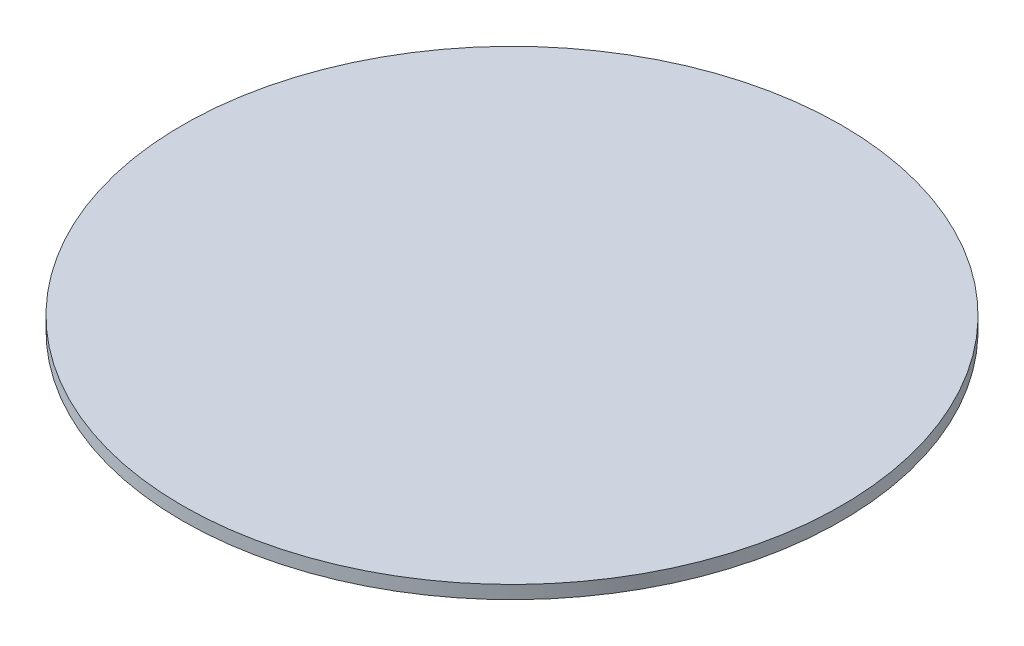
ISO-10303-21;
HEADER;
FILE_DESCRIPTION(('STEP AP214'),'2;1');
FILE_NAME('part.step','',(''),(''),'','','');
FILE_SCHEMA(('AUTOMOTIVE_DESIGN { 1 0 10303 214 1 1 1 1 }'));
ENDSEC;
DATA;
#1=APPLICATION_CONTEXT('core data for automotive mechanical design processes');
#2=APPLICATION_PROTOCOL_DEFINITION('international standard','automotive_design',2000,#1);
#3=PRODUCT_CONTEXT('',#1,'mechanical');
#4=PRODUCT('Part','Part','',(#3));
#5=PRODUCT_RELATED_PRODUCT_CATEGORY('part','',(#4));
#6=PRODUCT_DEFINITION_FORMATION('','',#4);
#7=PRODUCT_DEFINITION_CONTEXT('part definition',#1,'design');
#8=PRODUCT_DEFINITION('design','',#6,#7);
#9=PRODUCT_DEFINITION_SHAPE('','',#8);
#10=(LENGTH_UNIT() NAMED_UNIT(*) SI_UNIT(.MILLI.,.METRE.));
#11=(NAMED_UNIT(*) PLANE_ANGLE_UNIT() SI_UNIT($,.RADIAN.));
#12=(NAMED_UNIT(*) SI_UNIT($,.STERADIAN.) SOLID_ANGLE_UNIT());
#13=UNCERTAINTY_MEASURE_WITH_UNIT(LENGTH_MEASURE(1.E-05),#10,'distance_accuracy_value','');
#14=(GEOMETRIC_REPRESENTATION_CONTEXT(3) GLOBAL_UNCERTAINTY_ASSIGNED_CONTEXT((#13)) GLOBAL_UNIT_ASSIGNED_CONTEXT((#10,
#11,#12)) REPRESENTATION_CONTEXT('',''));
#15=CARTESIAN_POINT('',(0.,0.,0.));
#16=DIRECTION('',(0.,0.,1.));
#17=DIRECTION('',(1.,0.,0.));
#18=AXIS2_PLACEMENT_3D('',#15,#16,#17);
#19=CARTESIAN_POINT('',(0.,12.,0.));
#20=DIRECTION('',(0.,-1.,0.));
#21=DIRECTION('',(0.,0.,-1.));
#22=AXIS2_PLACEMENT_3D('',#19,#20,#21);
#23=CYLINDRICAL_SURFACE('',#22,300.);
#24=CARTESIAN_POINT('',(0.,12.,0.));
#25=DIRECTION('',(0.,1.,0.));
#26=DIRECTION('',(0.,0.,1.));
#27=AXIS2_PLACEMENT_3D('',#24,#25,#26);
#28=CIRCLE('',#27,300.);
#29=CARTESIAN_POINT('',(0.,12.,300.));
#30=VERTEX_POINT('',#29);
#31=EDGE_CURVE('E10',#30,#30,#28,.T.);
#32=ORIENTED_EDGE('',*,*,#31,.F.);
#33=EDGE_LOOP('',(#32));
#34=FACE_BOUND('',#33,.T.);
#35=CARTESIAN_POINT('',(0.,0.,0.));
#36=DIRECTION('',(0.,1.,0.));
#37=DIRECTION('',(0.,0.,1.));
#38=AXIS2_PLACEMENT_3D('',#35,#36,#37);
#39=CIRCLE('',#38,300.);
#40=CARTESIAN_POINT('',(0.,0.,300.));
#41=VERTEX_POINT('',#40);
#42=EDGE_CURVE('E46',#41,#41,#39,.T.);
#43=ORIENTED_EDGE('',*,*,#42,.T.);
#44=EDGE_LOOP('',(#43));
#45=FACE_BOUND('',#44,.T.);
#46=ADVANCED_FACE('F43',(#34,#45),#23,.T.);
#47=CARTESIAN_POINT('',(0.,12.,0.));
#48=DIRECTION('',(0.,1.,0.));
#49=DIRECTION('',(0.,0.,1.));
#50=AXIS2_PLACEMENT_3D('',#47,#48,#49);
#51=PLANE('',#50);
#52=ORIENTED_EDGE('',*,*,#31,.T.);
#53=EDGE_LOOP('',(#52));
#54=FACE_BOUND('',#53,.T.);
#55=ADVANCED_FACE('F91',(#54),#51,.T.);
#56=CARTESIAN_POINT('',(0.,0.,0.));
#57=DIRECTION('',(0.,1.,0.));
#58=DIRECTION('',(0.,0.,1.));
#59=AXIS2_PLACEMENT_3D('',#56,#57,#58);
#60=PLANE('',#59);
#61=CARTESIAN_POINT('',(0.,0.,0.));
#62=DIRECTION('',(0.,-1.,0.));
#63=DIRECTION('',(0.,0.,-1.));
#64=AXIS2_PLACEMENT_3D('',#61,#62,#63);
#65=CIRCLE('',#64,280.);
#66=CARTESIAN_POINT('',(0.,0.,-280.));
#67=VERTEX_POINT('',#66);
#68=EDGE_CURVE('E57',#67,#67,#65,.T.);
#69=ORIENTED_EDGE('',*,*,#68,.F.);
#70=EDGE_LOOP('',(#69));
#71=FACE_BOUND('',#70,.T.);
#72=ORIENTED_EDGE('',*,*,#42,.F.);
#73=EDGE_LOOP('',(#72));
#74=FACE_BOUND('',#73,.T.);
#75=ADVANCED_FACE('F85',(#71,#74),#60,.F.);
#76=CARTESIAN_POINT('',(0.,6.,0.));
#77=DIRECTION('',(0.,-1.,0.));
#78=DIRECTION('',(0.,0.,-1.));
#79=AXIS2_PLACEMENT_3D('',#76,#77,#78);
#80=CYLINDRICAL_SURFACE('',#79,280.);
#81=CARTESIAN_POINT('',(0.,6.,0.));
#82=DIRECTION('',(0.,-1.,0.));
#83=DIRECTION('',(0.,0.,-1.));
#84=AXIS2_PLACEMENT_3D('',#81,#82,#83);
#85=CIRCLE('',#84,280.);
#86=CARTESIAN_POINT('',(0.,6.,-280.));
#87=VERTEX_POINT('',#86);
#88=EDGE_CURVE('E55',#87,#87,#85,.T.);
#89=ORIENTED_EDGE('',*,*,#88,.F.);
#90=EDGE_LOOP('',(#89));
#91=FACE_BOUND('',#90,.T.);
#92=ORIENTED_EDGE('',*,*,#68,.T.);
#93=EDGE_LOOP('',(#92));
#94=FACE_BOUND('',#93,.T.);
#95=ADVANCED_FACE('F79',(#91,#94),#80,.F.);
#96=CARTESIAN_POINT('',(0.,6.,0.));
#97=DIRECTION('',(0.,-1.,0.));
#98=DIRECTION('',(0.,0.,-1.));
#99=AXIS2_PLACEMENT_3D('',#96,#97,#98);
#100=PLANE('',#99);
#101=CARTESIAN_POINT('',(0.,6.,0.));
#102=DIRECTION('',(0.,-1.,0.));
#103=DIRECTION('',(0.,0.,-1.));
#104=AXIS2_PLACEMENT_3D('',#101,#102,#103);
#105=CIRCLE('',#104,275.);
#106=CARTESIAN_POINT('',(0.,6.,-275.));
#107=VERTEX_POINT('',#106);
#108=EDGE_CURVE('E61',#107,#107,#105,.T.);
#109=ORIENTED_EDGE('',*,*,#108,.F.);
#110=EDGE_LOOP('',(#109));
#111=FACE_BOUND('',#110,.T.);
#112=ORIENTED_EDGE('',*,*,#88,.T.);
#113=EDGE_LOOP('',(#112));
#114=FACE_BOUND('',#113,.T.);
#115=ADVANCED_FACE('F76',(#111,#114),#100,.T.);
#116=CARTESIAN_POINT('',(0.,6.,0.));
#117=DIRECTION('',(0.,-1.,0.));
#118=DIRECTION('',(0.,0.,-1.));
#119=AXIS2_PLACEMENT_3D('',#116,#117,#118);
#120=CYLINDRICAL_SURFACE('',#119,275.);
#121=ORIENTED_EDGE('',*,*,#108,.T.);
#122=EDGE_LOOP('',(#121));
#123=FACE_BOUND('',#122,.T.);
#124=CARTESIAN_POINT('',(0.,0.,0.));
#125=DIRECTION('',(0.,-1.,0.));
#126=DIRECTION('',(0.,0.,-1.));
#127=AXIS2_PLACEMENT_3D('',#124,#125,#126);
#128=CIRCLE('',#127,275.);
#129=CARTESIAN_POINT('',(0.,0.,-275.));
#130=VERTEX_POINT('',#129);
#131=EDGE_CURVE('E65',#130,#130,#128,.T.);
#132=ORIENTED_EDGE('',*,*,#131,.F.);
#133=EDGE_LOOP('',(#132));
#134=FACE_BOUND('',#133,.T.);
#135=ADVANCED_FACE('F73',(#123,#134),#120,.T.);
#136=ORIENTED_EDGE('',*,*,#131,.T.);
#137=EDGE_LOOP('',(#136));
#138=FACE_BOUND('',#137,.T.);
#139=ADVANCED_FACE('F92',(#138),#60,.F.);
#140=CLOSED_SHELL('',(#46,#55,#75,#95,#115,#135,#139));
#141=MANIFOLD_SOLID_BREP('B2',#140);
#142=ADVANCED_BREP_SHAPE_REPRESENTATION('',(#18,#141),#14);
#143=SHAPE_DEFINITION_REPRESENTATION(#9,#142);
ENDSEC;
END-ISO-10303-21;
